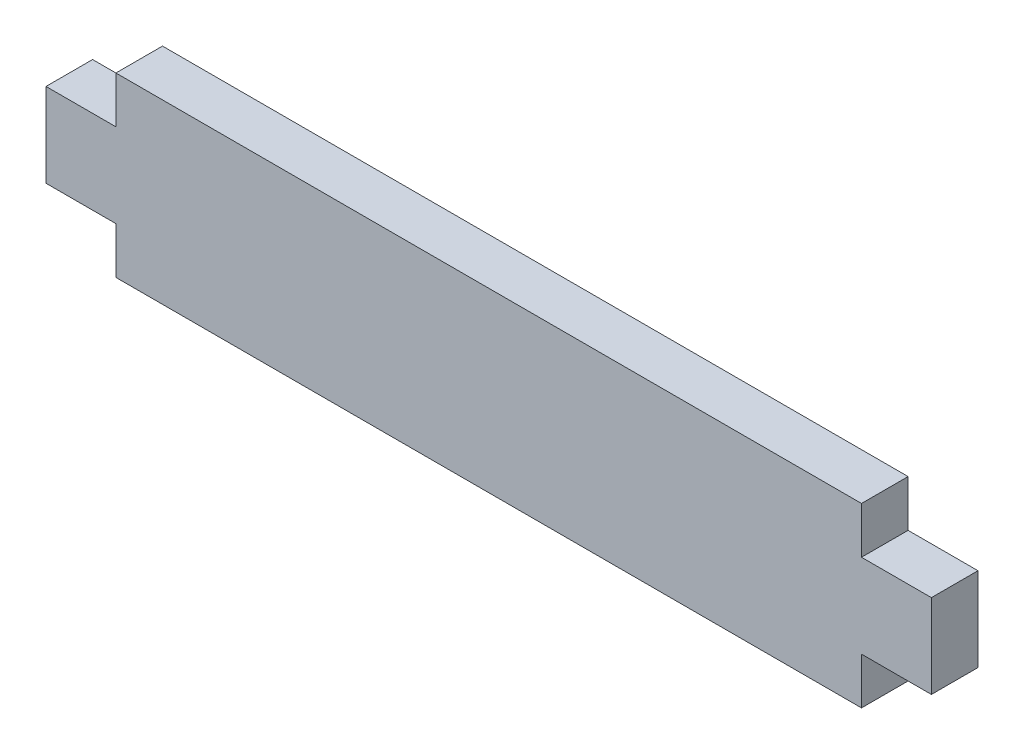
ISO-10303-21;
HEADER;
FILE_DESCRIPTION(('STEP AP214'),'2;1');
FILE_NAME('part.step','',(''),(''),'','','');
FILE_SCHEMA(('AUTOMOTIVE_DESIGN { 1 0 10303 214 1 1 1 1 }'));
ENDSEC;
DATA;
#1=APPLICATION_CONTEXT('core data for automotive mechanical design processes');
#2=APPLICATION_PROTOCOL_DEFINITION('international standard','automotive_design',2000,#1);
#3=PRODUCT_CONTEXT('',#1,'mechanical');
#4=PRODUCT('Part','Part','',(#3));
#5=PRODUCT_RELATED_PRODUCT_CATEGORY('part','',(#4));
#6=PRODUCT_DEFINITION_FORMATION('','',#4);
#7=PRODUCT_DEFINITION_CONTEXT('part definition',#1,'design');
#8=PRODUCT_DEFINITION('design','',#6,#7);
#9=PRODUCT_DEFINITION_SHAPE('','',#8);
#10=(LENGTH_UNIT() NAMED_UNIT(*) SI_UNIT(.MILLI.,.METRE.));
#11=(NAMED_UNIT(*) PLANE_ANGLE_UNIT() SI_UNIT($,.RADIAN.));
#12=(NAMED_UNIT(*) SI_UNIT($,.STERADIAN.) SOLID_ANGLE_UNIT());
#13=UNCERTAINTY_MEASURE_WITH_UNIT(LENGTH_MEASURE(1.E-05),#10,'distance_accuracy_value','');
#14=(GEOMETRIC_REPRESENTATION_CONTEXT(3) GLOBAL_UNCERTAINTY_ASSIGNED_CONTEXT((#13)) GLOBAL_UNIT_ASSIGNED_CONTEXT((#10,
#11,#12)) REPRESENTATION_CONTEXT('',''));
#15=CARTESIAN_POINT('',(0.,0.,0.));
#16=DIRECTION('',(0.,0.,1.));
#17=DIRECTION('',(1.,0.,0.));
#18=AXIS2_PLACEMENT_3D('',#15,#16,#17);
#19=CARTESIAN_POINT('',(0.,0.,5.));
#20=DIRECTION('',(-1.,0.,0.));
#21=DIRECTION('',(0.,-1.,0.));
#22=AXIS2_PLACEMENT_3D('',#19,#20,#21);
#23=PLANE('',#22);
#24=DIRECTION('',(0.,1.,0.));
#25=VECTOR('',#24,1.);
#26=CARTESIAN_POINT('',(0.,0.,0.));
#27=LINE('',#26,#25);
#28=CARTESIAN_POINT('',(0.,-5.,0.));
#29=VERTEX_POINT('',#28);
#30=CARTESIAN_POINT('',(0.,0.,0.));
#31=VERTEX_POINT('',#30);
#32=EDGE_CURVE('E153',#29,#31,#27,.T.);
#33=ORIENTED_EDGE('',*,*,#32,.T.);
#34=DIRECTION('',(0.,0.,-1.));
#35=VECTOR('',#34,1.);
#36=CARTESIAN_POINT('',(0.,0.,5.));
#37=LINE('',#36,#35);
#38=CARTESIAN_POINT('',(0.,0.,5.));
#39=VERTEX_POINT('',#38);
#40=EDGE_CURVE('E11',#39,#31,#37,.T.);
#41=ORIENTED_EDGE('',*,*,#40,.F.);
#42=DIRECTION('',(0.,1.,0.));
#43=VECTOR('',#42,1.);
#44=CARTESIAN_POINT('',(0.,0.,5.));
#45=LINE('',#44,#43);
#46=CARTESIAN_POINT('',(0.,-5.,5.));
#47=VERTEX_POINT('',#46);
#48=EDGE_CURVE('E175',#47,#39,#45,.T.);
#49=ORIENTED_EDGE('',*,*,#48,.F.);
#50=DIRECTION('',(0.,0.,-1.));
#51=VECTOR('',#50,1.);
#52=CARTESIAN_POINT('',(0.,-5.,5.));
#53=LINE('',#52,#51);
#54=EDGE_CURVE('E149',#47,#29,#53,.T.);
#55=ORIENTED_EDGE('',*,*,#54,.T.);
#56=EDGE_LOOP('',(#33,#41,#49,#55));
#57=FACE_BOUND('',#56,.T.);
#58=ADVANCED_FACE('F33',(#57),#23,.F.);
#59=CARTESIAN_POINT('',(0.,0.,5.));
#60=DIRECTION('',(0.,-1.,0.));
#61=DIRECTION('',(0.,0.,-1.));
#62=AXIS2_PLACEMENT_3D('',#59,#60,#61);
#63=PLANE('',#62);
#64=DIRECTION('',(-1.,0.,0.));
#65=VECTOR('',#64,1.);
#66=CARTESIAN_POINT('',(0.,0.,0.));
#67=LINE('',#66,#65);
#68=CARTESIAN_POINT('',(-80.,0.,0.));
#69=VERTEX_POINT('',#68);
#70=EDGE_CURVE('E156',#31,#69,#67,.T.);
#71=ORIENTED_EDGE('',*,*,#70,.T.);
#72=DIRECTION('',(0.,0.,-1.));
#73=VECTOR('',#72,1.);
#74=CARTESIAN_POINT('',(-80.,0.,5.));
#75=LINE('',#74,#73);
#76=CARTESIAN_POINT('',(-80.,0.,5.));
#77=VERTEX_POINT('',#76);
#78=EDGE_CURVE('E41',#77,#69,#75,.T.);
#79=ORIENTED_EDGE('',*,*,#78,.F.);
#80=DIRECTION('',(-1.,0.,0.));
#81=VECTOR('',#80,1.);
#82=CARTESIAN_POINT('',(0.,0.,5.));
#83=LINE('',#82,#81);
#84=EDGE_CURVE('E104',#39,#77,#83,.T.);
#85=ORIENTED_EDGE('',*,*,#84,.F.);
#86=ORIENTED_EDGE('',*,*,#40,.T.);
#87=EDGE_LOOP('',(#71,#79,#85,#86));
#88=FACE_BOUND('',#87,.T.);
#89=ADVANCED_FACE('F253',(#88),#63,.F.);
#90=CARTESIAN_POINT('',(-80.,0.,5.));
#91=DIRECTION('',(1.,0.,0.));
#92=DIRECTION('',(0.,0.,-1.));
#93=AXIS2_PLACEMENT_3D('',#90,#91,#92);
#94=PLANE('',#93);
#95=DIRECTION('',(0.,-1.,0.));
#96=VECTOR('',#95,1.);
#97=CARTESIAN_POINT('',(-80.,0.,0.));
#98=LINE('',#97,#96);
#99=CARTESIAN_POINT('',(-80.,-5.00000000000001,0.));
#100=VERTEX_POINT('',#99);
#101=EDGE_CURVE('E158',#69,#100,#98,.T.);
#102=ORIENTED_EDGE('',*,*,#101,.T.);
#103=DIRECTION('',(0.,0.,-1.));
#104=VECTOR('',#103,1.);
#105=CARTESIAN_POINT('',(-80.,-5.00000000000001,5.));
#106=LINE('',#105,#104);
#107=CARTESIAN_POINT('',(-80.,-5.00000000000001,5.));
#108=VERTEX_POINT('',#107);
#109=EDGE_CURVE('E194',#108,#100,#106,.T.);
#110=ORIENTED_EDGE('',*,*,#109,.F.);
#111=DIRECTION('',(0.,-1.,0.));
#112=VECTOR('',#111,1.);
#113=CARTESIAN_POINT('',(-80.,0.,5.));
#114=LINE('',#113,#112);
#115=EDGE_CURVE('E202',#77,#108,#114,.T.);
#116=ORIENTED_EDGE('',*,*,#115,.F.);
#117=ORIENTED_EDGE('',*,*,#78,.T.);
#118=EDGE_LOOP('',(#102,#110,#116,#117));
#119=FACE_BOUND('',#118,.T.);
#120=ADVANCED_FACE('F200',(#119),#94,.F.);
#121=CARTESIAN_POINT('',(-80.,-5.00000000000001,5.));
#122=DIRECTION('',(0.,-1.,0.));
#123=DIRECTION('',(1.,0.,0.));
#124=AXIS2_PLACEMENT_3D('',#121,#122,#123);
#125=PLANE('',#124);
#126=DIRECTION('',(-1.,0.,0.));
#127=VECTOR('',#126,1.);
#128=CARTESIAN_POINT('',(-80.,-5.00000000000001,0.));
#129=LINE('',#128,#127);
#130=CARTESIAN_POINT('',(-87.5,-5.00000000000001,0.));
#131=VERTEX_POINT('',#130);
#132=EDGE_CURVE('E160',#100,#131,#129,.T.);
#133=ORIENTED_EDGE('',*,*,#132,.T.);
#134=DIRECTION('',(0.,0.,-1.));
#135=VECTOR('',#134,1.);
#136=CARTESIAN_POINT('',(-87.5,-5.00000000000001,5.));
#137=LINE('',#136,#135);
#138=CARTESIAN_POINT('',(-87.5,-5.00000000000001,5.));
#139=VERTEX_POINT('',#138);
#140=EDGE_CURVE('E191',#139,#131,#137,.T.);
#141=ORIENTED_EDGE('',*,*,#140,.F.);
#142=DIRECTION('',(-1.,0.,0.));
#143=VECTOR('',#142,1.);
#144=CARTESIAN_POINT('',(-80.,-5.00000000000001,5.));
#145=LINE('',#144,#143);
#146=EDGE_CURVE('E220',#108,#139,#145,.T.);
#147=ORIENTED_EDGE('',*,*,#146,.F.);
#148=ORIENTED_EDGE('',*,*,#109,.T.);
#149=EDGE_LOOP('',(#133,#141,#147,#148));
#150=FACE_BOUND('',#149,.T.);
#151=ADVANCED_FACE('F211',(#150),#125,.F.);
#152=CARTESIAN_POINT('',(-87.5,-5.00000000000001,5.));
#153=DIRECTION('',(1.,0.,0.));
#154=DIRECTION('',(0.,0.,-1.));
#155=AXIS2_PLACEMENT_3D('',#152,#153,#154);
#156=PLANE('',#155);
#157=DIRECTION('',(0.,-1.,0.));
#158=VECTOR('',#157,1.);
#159=CARTESIAN_POINT('',(-87.5,-5.00000000000001,0.));
#160=LINE('',#159,#158);
#161=CARTESIAN_POINT('',(-87.5,-14.,0.));
#162=VERTEX_POINT('',#161);
#163=EDGE_CURVE('E162',#131,#162,#160,.T.);
#164=ORIENTED_EDGE('',*,*,#163,.T.);
#165=DIRECTION('',(0.,0.,-1.));
#166=VECTOR('',#165,1.);
#167=CARTESIAN_POINT('',(-87.5,-14.,5.));
#168=LINE('',#167,#166);
#169=CARTESIAN_POINT('',(-87.5,-14.,5.));
#170=VERTEX_POINT('',#169);
#171=EDGE_CURVE('E188',#170,#162,#168,.T.);
#172=ORIENTED_EDGE('',*,*,#171,.F.);
#173=DIRECTION('',(0.,-1.,0.));
#174=VECTOR('',#173,1.);
#175=CARTESIAN_POINT('',(-87.5,-5.00000000000001,5.));
#176=LINE('',#175,#174);
#177=EDGE_CURVE('E217',#139,#170,#176,.T.);
#178=ORIENTED_EDGE('',*,*,#177,.F.);
#179=ORIENTED_EDGE('',*,*,#140,.T.);
#180=EDGE_LOOP('',(#164,#172,#178,#179));
#181=FACE_BOUND('',#180,.T.);
#182=ADVANCED_FACE('F215',(#181),#156,.F.);
#183=CARTESIAN_POINT('',(-80.,-14.,5.));
#184=DIRECTION('',(0.,1.,0.));
#185=DIRECTION('',(0.,0.,1.));
#186=AXIS2_PLACEMENT_3D('',#183,#184,#185);
#187=PLANE('',#186);
#188=DIRECTION('',(1.,0.,0.));
#189=VECTOR('',#188,1.);
#190=CARTESIAN_POINT('',(-80.,-14.,0.));
#191=LINE('',#190,#189);
#192=CARTESIAN_POINT('',(-80.,-14.,0.));
#193=VERTEX_POINT('',#192);
#194=EDGE_CURVE('E164',#162,#193,#191,.T.);
#195=ORIENTED_EDGE('',*,*,#194,.T.);
#196=DIRECTION('',(0.,0.,-1.));
#197=VECTOR('',#196,1.);
#198=CARTESIAN_POINT('',(-80.,-14.,5.));
#199=LINE('',#198,#197);
#200=CARTESIAN_POINT('',(-80.,-14.,5.));
#201=VERTEX_POINT('',#200);
#202=EDGE_CURVE('E185',#201,#193,#199,.T.);
#203=ORIENTED_EDGE('',*,*,#202,.F.);
#204=DIRECTION('',(1.,0.,0.));
#205=VECTOR('',#204,1.);
#206=CARTESIAN_POINT('',(-80.,-14.,5.));
#207=LINE('',#206,#205);
#208=EDGE_CURVE('E219',#170,#201,#207,.T.);
#209=ORIENTED_EDGE('',*,*,#208,.F.);
#210=ORIENTED_EDGE('',*,*,#171,.T.);
#211=EDGE_LOOP('',(#195,#203,#209,#210));
#212=FACE_BOUND('',#211,.T.);
#213=ADVANCED_FACE('F266',(#212),#187,.F.);
#214=CARTESIAN_POINT('',(-80.,-14.,5.));
#215=DIRECTION('',(1.,0.,0.));
#216=DIRECTION('',(0.,0.,-1.));
#217=AXIS2_PLACEMENT_3D('',#214,#215,#216);
#218=PLANE('',#217);
#219=DIRECTION('',(0.,-1.,0.));
#220=VECTOR('',#219,1.);
#221=CARTESIAN_POINT('',(-80.,-14.,0.));
#222=LINE('',#221,#220);
#223=CARTESIAN_POINT('',(-80.,-19.,0.));
#224=VERTEX_POINT('',#223);
#225=EDGE_CURVE('E166',#193,#224,#222,.T.);
#226=ORIENTED_EDGE('',*,*,#225,.T.);
#227=DIRECTION('',(0.,0.,-1.));
#228=VECTOR('',#227,1.);
#229=CARTESIAN_POINT('',(-80.,-19.,5.));
#230=LINE('',#229,#228);
#231=CARTESIAN_POINT('',(-80.,-19.,5.));
#232=VERTEX_POINT('',#231);
#233=EDGE_CURVE('E182',#232,#224,#230,.T.);
#234=ORIENTED_EDGE('',*,*,#233,.F.);
#235=DIRECTION('',(0.,-1.,0.));
#236=VECTOR('',#235,1.);
#237=CARTESIAN_POINT('',(-80.,-14.,5.));
#238=LINE('',#237,#236);
#239=EDGE_CURVE('E222',#201,#232,#238,.T.);
#240=ORIENTED_EDGE('',*,*,#239,.F.);
#241=ORIENTED_EDGE('',*,*,#202,.T.);
#242=EDGE_LOOP('',(#226,#234,#240,#241));
#243=FACE_BOUND('',#242,.T.);
#244=ADVANCED_FACE('F269',(#243),#218,.F.);
#245=CARTESIAN_POINT('',(0.,-19.,5.));
#246=DIRECTION('',(0.,1.,0.));
#247=DIRECTION('',(-1.,0.,0.));
#248=AXIS2_PLACEMENT_3D('',#245,#246,#247);
#249=PLANE('',#248);
#250=DIRECTION('',(1.,0.,0.));
#251=VECTOR('',#250,1.);
#252=CARTESIAN_POINT('',(0.,-19.,0.));
#253=LINE('',#252,#251);
#254=CARTESIAN_POINT('',(0.,-19.,0.));
#255=VERTEX_POINT('',#254);
#256=EDGE_CURVE('E168',#224,#255,#253,.T.);
#257=ORIENTED_EDGE('',*,*,#256,.T.);
#258=DIRECTION('',(0.,0.,-1.));
#259=VECTOR('',#258,1.);
#260=CARTESIAN_POINT('',(0.,-19.,5.));
#261=LINE('',#260,#259);
#262=CARTESIAN_POINT('',(0.,-19.,5.));
#263=VERTEX_POINT('',#262);
#264=EDGE_CURVE('E179',#263,#255,#261,.T.);
#265=ORIENTED_EDGE('',*,*,#264,.F.);
#266=DIRECTION('',(1.,0.,0.));
#267=VECTOR('',#266,1.);
#268=CARTESIAN_POINT('',(0.,-19.,5.));
#269=LINE('',#268,#267);
#270=EDGE_CURVE('E228',#232,#263,#269,.T.);
#271=ORIENTED_EDGE('',*,*,#270,.F.);
#272=ORIENTED_EDGE('',*,*,#233,.T.);
#273=EDGE_LOOP('',(#257,#265,#271,#272));
#274=FACE_BOUND('',#273,.T.);
#275=ADVANCED_FACE('F234',(#274),#249,.F.);
#276=CARTESIAN_POINT('',(0.,-14.,5.));
#277=DIRECTION('',(-1.,0.,0.));
#278=DIRECTION('',(0.,-1.,0.));
#279=AXIS2_PLACEMENT_3D('',#276,#277,#278);
#280=PLANE('',#279);
#281=DIRECTION('',(0.,1.,0.));
#282=VECTOR('',#281,1.);
#283=CARTESIAN_POINT('',(0.,-14.,0.));
#284=LINE('',#283,#282);
#285=CARTESIAN_POINT('',(0.,-14.,0.));
#286=VERTEX_POINT('',#285);
#287=EDGE_CURVE('E170',#255,#286,#284,.T.);
#288=ORIENTED_EDGE('',*,*,#287,.T.);
#289=DIRECTION('',(0.,0.,-1.));
#290=VECTOR('',#289,1.);
#291=CARTESIAN_POINT('',(0.,-14.,5.));
#292=LINE('',#291,#290);
#293=CARTESIAN_POINT('',(0.,-14.,5.));
#294=VERTEX_POINT('',#293);
#295=EDGE_CURVE('E144',#294,#286,#292,.T.);
#296=ORIENTED_EDGE('',*,*,#295,.F.);
#297=DIRECTION('',(0.,1.,0.));
#298=VECTOR('',#297,1.);
#299=CARTESIAN_POINT('',(0.,-14.,5.));
#300=LINE('',#299,#298);
#301=EDGE_CURVE('E135',#263,#294,#300,.T.);
#302=ORIENTED_EDGE('',*,*,#301,.F.);
#303=ORIENTED_EDGE('',*,*,#264,.T.);
#304=EDGE_LOOP('',(#288,#296,#302,#303));
#305=FACE_BOUND('',#304,.T.);
#306=ADVANCED_FACE('F238',(#305),#280,.F.);
#307=CARTESIAN_POINT('',(0.,-14.,5.));
#308=DIRECTION('',(0.,1.,0.));
#309=DIRECTION('',(0.,0.,1.));
#310=AXIS2_PLACEMENT_3D('',#307,#308,#309);
#311=PLANE('',#310);
#312=DIRECTION('',(1.,0.,0.));
#313=VECTOR('',#312,1.);
#314=CARTESIAN_POINT('',(0.,-14.,0.));
#315=LINE('',#314,#313);
#316=CARTESIAN_POINT('',(7.5,-14.,0.));
#317=VERTEX_POINT('',#316);
#318=EDGE_CURVE('E143',#286,#317,#315,.T.);
#319=ORIENTED_EDGE('',*,*,#318,.T.);
#320=DIRECTION('',(0.,0.,-1.));
#321=VECTOR('',#320,1.);
#322=CARTESIAN_POINT('',(7.5,-14.,5.));
#323=LINE('',#322,#321);
#324=CARTESIAN_POINT('',(7.5,-14.,5.));
#325=VERTEX_POINT('',#324);
#326=EDGE_CURVE('E140',#325,#317,#323,.T.);
#327=ORIENTED_EDGE('',*,*,#326,.F.);
#328=DIRECTION('',(1.,0.,0.));
#329=VECTOR('',#328,1.);
#330=CARTESIAN_POINT('',(0.,-14.,5.));
#331=LINE('',#330,#329);
#332=EDGE_CURVE('E129',#294,#325,#331,.T.);
#333=ORIENTED_EDGE('',*,*,#332,.F.);
#334=ORIENTED_EDGE('',*,*,#295,.T.);
#335=EDGE_LOOP('',(#319,#327,#333,#334));
#336=FACE_BOUND('',#335,.T.);
#337=ADVANCED_FACE('F141',(#336),#311,.F.);
#338=CARTESIAN_POINT('',(7.5,-5.,5.));
#339=DIRECTION('',(-1.,0.,0.));
#340=DIRECTION('',(0.,0.,1.));
#341=AXIS2_PLACEMENT_3D('',#338,#339,#340);
#342=PLANE('',#341);
#343=DIRECTION('',(0.,1.,0.));
#344=VECTOR('',#343,1.);
#345=CARTESIAN_POINT('',(7.5,-5.,0.));
#346=LINE('',#345,#344);
#347=CARTESIAN_POINT('',(7.5,-5.,0.));
#348=VERTEX_POINT('',#347);
#349=EDGE_CURVE('E90',#317,#348,#346,.T.);
#350=ORIENTED_EDGE('',*,*,#349,.T.);
#351=DIRECTION('',(0.,0.,-1.));
#352=VECTOR('',#351,1.);
#353=CARTESIAN_POINT('',(7.5,-5.,5.));
#354=LINE('',#353,#352);
#355=CARTESIAN_POINT('',(7.5,-5.,5.));
#356=VERTEX_POINT('',#355);
#357=EDGE_CURVE('E145',#356,#348,#354,.T.);
#358=ORIENTED_EDGE('',*,*,#357,.F.);
#359=DIRECTION('',(0.,1.,0.));
#360=VECTOR('',#359,1.);
#361=CARTESIAN_POINT('',(7.5,-5.,5.));
#362=LINE('',#361,#360);
#363=EDGE_CURVE('E133',#325,#356,#362,.T.);
#364=ORIENTED_EDGE('',*,*,#363,.F.);
#365=ORIENTED_EDGE('',*,*,#326,.T.);
#366=EDGE_LOOP('',(#350,#358,#364,#365));
#367=FACE_BOUND('',#366,.T.);
#368=ADVANCED_FACE('F147',(#367),#342,.F.);
#369=CARTESIAN_POINT('',(0.,-5.,5.));
#370=DIRECTION('',(0.,-1.,0.));
#371=DIRECTION('',(0.,0.,-1.));
#372=AXIS2_PLACEMENT_3D('',#369,#370,#371);
#373=PLANE('',#372);
#374=DIRECTION('',(-1.,0.,0.));
#375=VECTOR('',#374,1.);
#376=CARTESIAN_POINT('',(0.,-5.,0.));
#377=LINE('',#376,#375);
#378=EDGE_CURVE('E96',#348,#29,#377,.T.);
#379=ORIENTED_EDGE('',*,*,#378,.T.);
#380=ORIENTED_EDGE('',*,*,#54,.F.);
#381=DIRECTION('',(-1.,0.,0.));
#382=VECTOR('',#381,1.);
#383=CARTESIAN_POINT('',(0.,-5.,5.));
#384=LINE('',#383,#382);
#385=EDGE_CURVE('E49',#356,#47,#384,.T.);
#386=ORIENTED_EDGE('',*,*,#385,.F.);
#387=ORIENTED_EDGE('',*,*,#357,.T.);
#388=EDGE_LOOP('',(#379,#380,#386,#387));
#389=FACE_BOUND('',#388,.T.);
#390=ADVANCED_FACE('F242',(#389),#373,.F.);
#391=CARTESIAN_POINT('',(0.,0.,5.));
#392=DIRECTION('',(0.,0.,1.));
#393=DIRECTION('',(1.,0.,0.));
#394=AXIS2_PLACEMENT_3D('',#391,#392,#393);
#395=PLANE('',#394);
#396=ORIENTED_EDGE('',*,*,#48,.T.);
#397=ORIENTED_EDGE('',*,*,#84,.T.);
#398=ORIENTED_EDGE('',*,*,#115,.T.);
#399=ORIENTED_EDGE('',*,*,#146,.T.);
#400=ORIENTED_EDGE('',*,*,#177,.T.);
#401=ORIENTED_EDGE('',*,*,#208,.T.);
#402=ORIENTED_EDGE('',*,*,#239,.T.);
#403=ORIENTED_EDGE('',*,*,#270,.T.);
#404=ORIENTED_EDGE('',*,*,#301,.T.);
#405=ORIENTED_EDGE('',*,*,#332,.T.);
#406=ORIENTED_EDGE('',*,*,#363,.T.);
#407=ORIENTED_EDGE('',*,*,#385,.T.);
#408=EDGE_LOOP('',(#396,#397,#398,#399,#400,#401,#402,#403,#404,#405,#406,#407));
#409=FACE_BOUND('',#408,.T.);
#410=ADVANCED_FACE('F131',(#409),#395,.T.);
#411=CARTESIAN_POINT('',(0.,0.,0.));
#412=DIRECTION('',(0.,0.,1.));
#413=DIRECTION('',(1.,0.,0.));
#414=AXIS2_PLACEMENT_3D('',#411,#412,#413);
#415=PLANE('',#414);
#416=ORIENTED_EDGE('',*,*,#32,.F.);
#417=ORIENTED_EDGE('',*,*,#378,.F.);
#418=ORIENTED_EDGE('',*,*,#349,.F.);
#419=ORIENTED_EDGE('',*,*,#318,.F.);
#420=ORIENTED_EDGE('',*,*,#287,.F.);
#421=ORIENTED_EDGE('',*,*,#256,.F.);
#422=ORIENTED_EDGE('',*,*,#225,.F.);
#423=ORIENTED_EDGE('',*,*,#194,.F.);
#424=ORIENTED_EDGE('',*,*,#163,.F.);
#425=ORIENTED_EDGE('',*,*,#132,.F.);
#426=ORIENTED_EDGE('',*,*,#101,.F.);
#427=ORIENTED_EDGE('',*,*,#70,.F.);
#428=EDGE_LOOP('',(#416,#417,#418,#419,#420,#421,#422,#423,#424,#425,#426,#427));
#429=FACE_BOUND('',#428,.T.);
#430=ADVANCED_FACE('F206',(#429),#415,.F.);
#431=CLOSED_SHELL('',(#58,#89,#120,#151,#182,#213,#244,#275,#306,#337,#368,#390,#410,#430));
#432=MANIFOLD_SOLID_BREP('B2',#431);
#433=ADVANCED_BREP_SHAPE_REPRESENTATION('',(#18,#432),#14);
#434=SHAPE_DEFINITION_REPRESENTATION(#9,#433);
ENDSEC;
END-ISO-10303-21;
